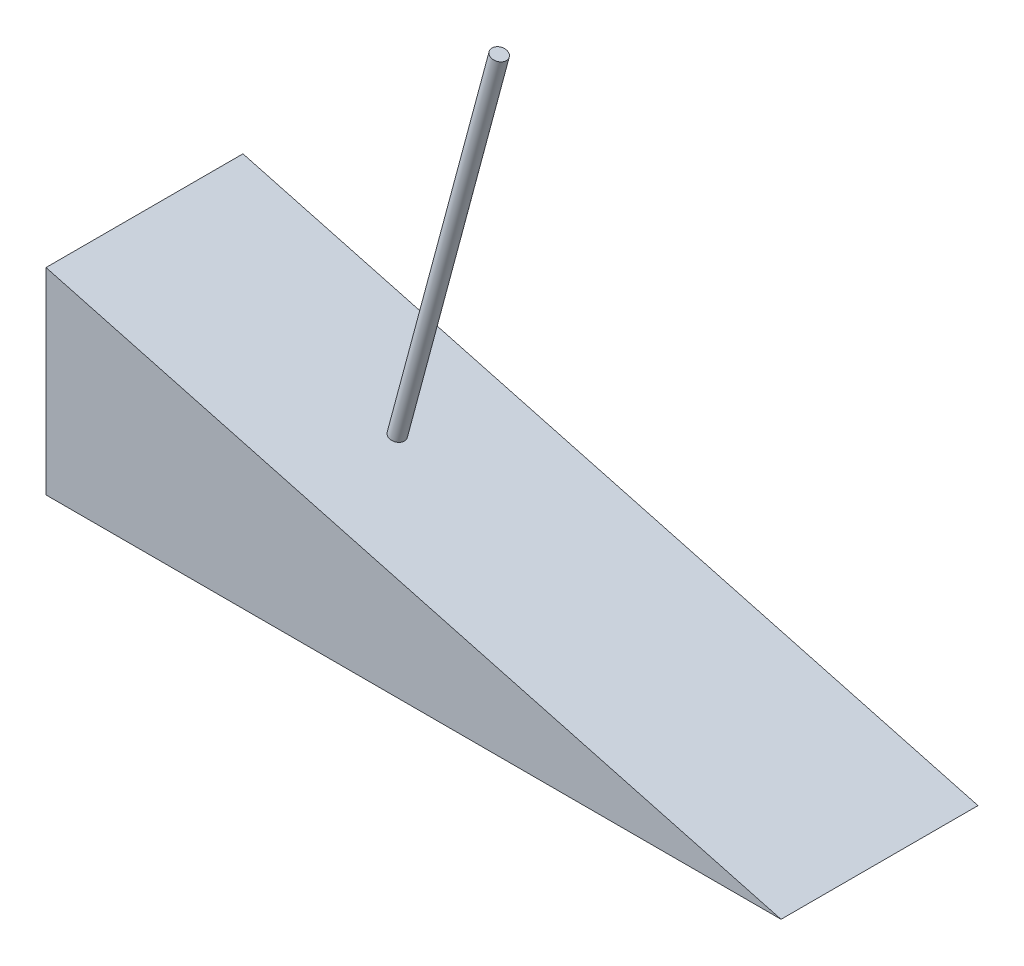
ISO-10303-21;
HEADER;
FILE_DESCRIPTION(('STEP AP214'),'2;1');
FILE_NAME('part.step','',(''),(''),'','','');
FILE_SCHEMA(('AUTOMOTIVE_DESIGN { 1 0 10303 214 1 1 1 1 }'));
ENDSEC;
DATA;
#1=APPLICATION_CONTEXT('core data for automotive mechanical design processes');
#2=APPLICATION_PROTOCOL_DEFINITION('international standard','automotive_design',2000,#1);
#3=PRODUCT_CONTEXT('',#1,'mechanical');
#4=PRODUCT('Part','Part','',(#3));
#5=PRODUCT_RELATED_PRODUCT_CATEGORY('part','',(#4));
#6=PRODUCT_DEFINITION_FORMATION('','',#4);
#7=PRODUCT_DEFINITION_CONTEXT('part definition',#1,'design');
#8=PRODUCT_DEFINITION('design','',#6,#7);
#9=PRODUCT_DEFINITION_SHAPE('','',#8);
#10=(LENGTH_UNIT() NAMED_UNIT(*) SI_UNIT(.MILLI.,.METRE.));
#11=(NAMED_UNIT(*) PLANE_ANGLE_UNIT() SI_UNIT($,.RADIAN.));
#12=(NAMED_UNIT(*) SI_UNIT($,.STERADIAN.) SOLID_ANGLE_UNIT());
#13=UNCERTAINTY_MEASURE_WITH_UNIT(LENGTH_MEASURE(1.E-05),#10,'distance_accuracy_value','');
#14=(GEOMETRIC_REPRESENTATION_CONTEXT(3) GLOBAL_UNCERTAINTY_ASSIGNED_CONTEXT((#13)) GLOBAL_UNIT_ASSIGNED_CONTEXT((#10,
#11,#12)) REPRESENTATION_CONTEXT('',''));
#15=CARTESIAN_POINT('',(0.,0.,0.));
#16=DIRECTION('',(0.,0.,1.));
#17=DIRECTION('',(1.,0.,0.));
#18=AXIS2_PLACEMENT_3D('',#15,#16,#17);
#19=CARTESIAN_POINT('',(-22.1506827669342,0.,20.));
#20=DIRECTION('',(1.,0.,0.));
#21=DIRECTION('',(0.,1.,0.));
#22=AXIS2_PLACEMENT_3D('',#19,#20,#21);
#23=PLANE('',#22);
#24=DIRECTION('',(0.,-1.,0.));
#25=VECTOR('',#24,1.);
#26=CARTESIAN_POINT('',(-22.1506827669342,0.,0.));
#27=LINE('',#26,#25);
#28=CARTESIAN_POINT('',(-22.1506827669342,20.,0.));
#29=VERTEX_POINT('',#28);
#30=CARTESIAN_POINT('',(-22.1506827669342,0.,0.));
#31=VERTEX_POINT('',#30);
#32=EDGE_CURVE('E97',#29,#31,#27,.T.);
#33=ORIENTED_EDGE('',*,*,#32,.T.);
#34=DIRECTION('',(0.,0.,-1.));
#35=VECTOR('',#34,1.);
#36=CARTESIAN_POINT('',(-22.1506827669342,0.,20.));
#37=LINE('',#36,#35);
#38=CARTESIAN_POINT('',(-22.1506827669342,0.,20.));
#39=VERTEX_POINT('',#38);
#40=EDGE_CURVE('E54',#39,#31,#37,.T.);
#41=ORIENTED_EDGE('',*,*,#40,.F.);
#42=DIRECTION('',(0.,-1.,0.));
#43=VECTOR('',#42,1.);
#44=CARTESIAN_POINT('',(-22.1506827669342,0.,20.));
#45=LINE('',#44,#43);
#46=CARTESIAN_POINT('',(-22.1506827669342,20.,20.));
#47=VERTEX_POINT('',#46);
#48=EDGE_CURVE('E89',#47,#39,#45,.T.);
#49=ORIENTED_EDGE('',*,*,#48,.F.);
#50=DIRECTION('',(0.,0.,-1.));
#51=VECTOR('',#50,1.);
#52=CARTESIAN_POINT('',(-22.1506827669342,20.,20.));
#53=LINE('',#52,#51);
#54=EDGE_CURVE('E100',#47,#29,#53,.T.);
#55=ORIENTED_EDGE('',*,*,#54,.T.);
#56=EDGE_LOOP('',(#33,#41,#49,#55));
#57=FACE_BOUND('',#56,.T.);
#58=ADVANCED_FACE('F45',(#57),#23,.F.);
#59=CARTESIAN_POINT('',(52.4903333844453,0.,20.));
#60=DIRECTION('',(0.,1.,0.));
#61=DIRECTION('',(-1.,0.,0.));
#62=AXIS2_PLACEMENT_3D('',#59,#60,#61);
#63=PLANE('',#62);
#64=DIRECTION('',(1.,0.,0.));
#65=VECTOR('',#64,1.);
#66=CARTESIAN_POINT('',(52.4903333844453,0.,0.));
#67=LINE('',#66,#65);
#68=CARTESIAN_POINT('',(52.4903333844453,0.,0.));
#69=VERTEX_POINT('',#68);
#70=EDGE_CURVE('E75',#31,#69,#67,.T.);
#71=ORIENTED_EDGE('',*,*,#70,.T.);
#72=DIRECTION('',(0.,0.,-1.));
#73=VECTOR('',#72,1.);
#74=CARTESIAN_POINT('',(52.4903333844453,0.,20.));
#75=LINE('',#74,#73);
#76=CARTESIAN_POINT('',(52.4903333844453,0.,20.));
#77=VERTEX_POINT('',#76);
#78=EDGE_CURVE('E87',#77,#69,#75,.T.);
#79=ORIENTED_EDGE('',*,*,#78,.F.);
#80=DIRECTION('',(1.,0.,0.));
#81=VECTOR('',#80,1.);
#82=CARTESIAN_POINT('',(52.4903333844453,0.,20.));
#83=LINE('',#82,#81);
#84=EDGE_CURVE('E83',#39,#77,#83,.T.);
#85=ORIENTED_EDGE('',*,*,#84,.F.);
#86=ORIENTED_EDGE('',*,*,#40,.T.);
#87=EDGE_LOOP('',(#71,#79,#85,#86));
#88=FACE_BOUND('',#87,.T.);
#89=ADVANCED_FACE('F84',(#88),#63,.F.);
#90=CARTESIAN_POINT('',(-22.1506827669342,20.,20.));
#91=DIRECTION('',(-0.258819045102514,-0.96592582628907,0.));
#92=DIRECTION('',(0.96592582628907,-0.258819045102514,0.));
#93=AXIS2_PLACEMENT_3D('',#90,#91,#92);
#94=PLANE('',#93);
#95=CARTESIAN_POINT('',(3.51618561020046,13.122583346111,9.99999999999999));
#96=DIRECTION('',(-0.258819045102514,-0.96592582628907,0.));
#97=DIRECTION('',(0.96592582628907,-0.258819045102514,0.));
#98=AXIS2_PLACEMENT_3D('',#95,#96,#97);
#99=CIRCLE('',#98,0.750000000000001);
#100=CARTESIAN_POINT('',(4.24062997991726,12.9284690622841,9.99999999999999));
#101=VERTEX_POINT('',#100);
#102=EDGE_CURVE('E11',#101,#101,#99,.F.);
#103=ORIENTED_EDGE('',*,*,#102,.F.);
#104=EDGE_LOOP('',(#103));
#105=FACE_BOUND('',#104,.T.);
#106=DIRECTION('',(-0.96592582628907,0.258819045102514,0.));
#107=VECTOR('',#106,1.);
#108=CARTESIAN_POINT('',(-22.1506827669342,20.,0.));
#109=LINE('',#108,#107);
#110=EDGE_CURVE('E80',#69,#29,#109,.T.);
#111=ORIENTED_EDGE('',*,*,#110,.T.);
#112=ORIENTED_EDGE('',*,*,#54,.F.);
#113=DIRECTION('',(-0.96592582628907,0.258819045102514,0.));
#114=VECTOR('',#113,1.);
#115=CARTESIAN_POINT('',(-22.1506827669342,20.,20.));
#116=LINE('',#115,#114);
#117=EDGE_CURVE('E62',#77,#47,#116,.T.);
#118=ORIENTED_EDGE('',*,*,#117,.F.);
#119=ORIENTED_EDGE('',*,*,#78,.T.);
#120=EDGE_LOOP('',(#111,#112,#118,#119));
#121=FACE_BOUND('',#120,.T.);
#122=ADVANCED_FACE('F127',(#105,#121),#94,.F.);
#123=CARTESIAN_POINT('',(0.,0.,20.));
#124=DIRECTION('',(0.,0.,1.));
#125=DIRECTION('',(1.,0.,0.));
#126=AXIS2_PLACEMENT_3D('',#123,#124,#125);
#127=PLANE('',#126);
#128=ORIENTED_EDGE('',*,*,#48,.T.);
#129=ORIENTED_EDGE('',*,*,#84,.T.);
#130=ORIENTED_EDGE('',*,*,#117,.T.);
#131=EDGE_LOOP('',(#128,#129,#130));
#132=FACE_BOUND('',#131,.T.);
#133=ADVANCED_FACE('F92',(#132),#127,.T.);
#134=CARTESIAN_POINT('',(0.,0.,0.));
#135=DIRECTION('',(0.,0.,1.));
#136=DIRECTION('',(1.,0.,0.));
#137=AXIS2_PLACEMENT_3D('',#134,#135,#136);
#138=PLANE('',#137);
#139=ORIENTED_EDGE('',*,*,#32,.F.);
#140=ORIENTED_EDGE('',*,*,#110,.F.);
#141=ORIENTED_EDGE('',*,*,#70,.F.);
#142=EDGE_LOOP('',(#139,#140,#141));
#143=FACE_BOUND('',#142,.T.);
#144=ADVANCED_FACE('F123',(#143),#138,.F.);
#145=CARTESIAN_POINT('',(13.868947414301,51.7596163976738,9.99999999999999));
#146=DIRECTION('',(-0.258819045102514,-0.96592582628907,0.));
#147=DIRECTION('',(0.96592582628907,-0.258819045102514,0.));
#148=AXIS2_PLACEMENT_3D('',#145,#146,#147);
#149=CYLINDRICAL_SURFACE('',#148,0.750000000000001);
#150=CARTESIAN_POINT('',(13.868947414301,51.7596163976738,9.99999999999999));
#151=DIRECTION('',(0.258819045102514,0.96592582628907,0.));
#152=DIRECTION('',(-0.96592582628907,0.258819045102514,0.));
#153=AXIS2_PLACEMENT_3D('',#150,#151,#152);
#154=CIRCLE('',#153,0.750000000000001);
#155=CARTESIAN_POINT('',(13.1445030445842,51.9537306815007,9.99999999999999));
#156=VERTEX_POINT('',#155);
#157=EDGE_CURVE('E111',#156,#156,#154,.T.);
#158=ORIENTED_EDGE('',*,*,#157,.F.);
#159=EDGE_LOOP('',(#158));
#160=FACE_BOUND('',#159,.T.);
#161=ORIENTED_EDGE('',*,*,#102,.T.);
#162=EDGE_LOOP('',(#161));
#163=FACE_BOUND('',#162,.T.);
#164=ADVANCED_FACE('F120',(#160,#163),#149,.T.);
#165=CARTESIAN_POINT('',(13.868947414301,51.7596163976738,9.99999999999999));
#166=DIRECTION('',(0.258819045102514,0.96592582628907,0.));
#167=DIRECTION('',(-0.96592582628907,0.258819045102514,0.));
#168=AXIS2_PLACEMENT_3D('',#165,#166,#167);
#169=PLANE('',#168);
#170=ORIENTED_EDGE('',*,*,#157,.T.);
#171=EDGE_LOOP('',(#170));
#172=FACE_BOUND('',#171,.T.);
#173=ADVANCED_FACE('F118',(#172),#169,.T.);
#174=CLOSED_SHELL('',(#58,#89,#122,#133,#144,#164,#173));
#175=MANIFOLD_SOLID_BREP('B2',#174);
#176=ADVANCED_BREP_SHAPE_REPRESENTATION('',(#18,#175),#14);
#177=SHAPE_DEFINITION_REPRESENTATION(#9,#176);
ENDSEC;
END-ISO-10303-21;
